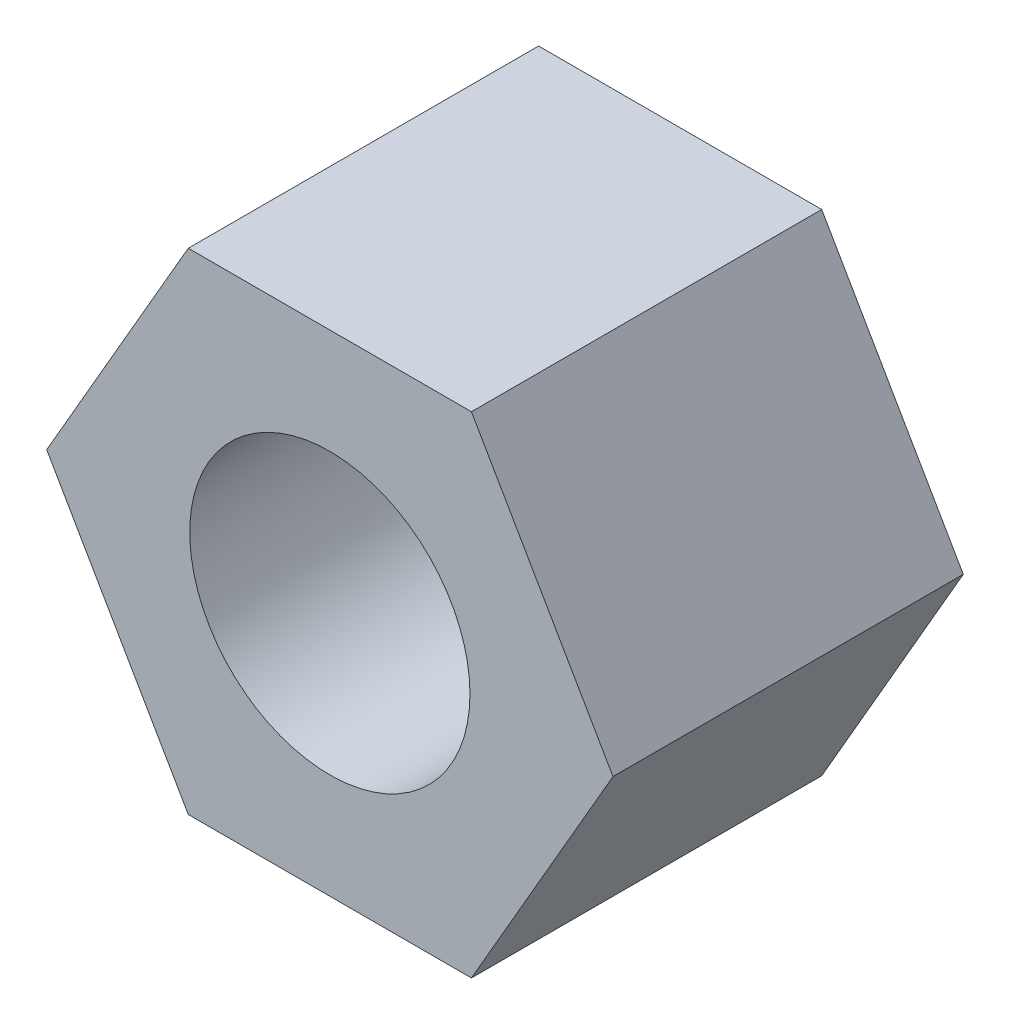
ISO-10303-21;
HEADER;
FILE_DESCRIPTION(('STEP AP214'),'2;1');
FILE_NAME('part.step','',(''),(''),'','','');
FILE_SCHEMA(('AUTOMOTIVE_DESIGN { 1 0 10303 214 1 1 1 1 }'));
ENDSEC;
DATA;
#1=APPLICATION_CONTEXT('core data for automotive mechanical design processes');
#2=APPLICATION_PROTOCOL_DEFINITION('international standard','automotive_design',2000,#1);
#3=PRODUCT_CONTEXT('',#1,'mechanical');
#4=PRODUCT('Part','Part','',(#3));
#5=PRODUCT_RELATED_PRODUCT_CATEGORY('part','',(#4));
#6=PRODUCT_DEFINITION_FORMATION('','',#4);
#7=PRODUCT_DEFINITION_CONTEXT('part definition',#1,'design');
#8=PRODUCT_DEFINITION('design','',#6,#7);
#9=PRODUCT_DEFINITION_SHAPE('','',#8);
#10=(LENGTH_UNIT() NAMED_UNIT(*) SI_UNIT(.MILLI.,.METRE.));
#11=(NAMED_UNIT(*) PLANE_ANGLE_UNIT() SI_UNIT($,.RADIAN.));
#12=(NAMED_UNIT(*) SI_UNIT($,.STERADIAN.) SOLID_ANGLE_UNIT());
#13=UNCERTAINTY_MEASURE_WITH_UNIT(LENGTH_MEASURE(1.E-05),#10,'distance_accuracy_value','');
#14=(GEOMETRIC_REPRESENTATION_CONTEXT(3) GLOBAL_UNCERTAINTY_ASSIGNED_CONTEXT((#13)) GLOBAL_UNIT_ASSIGNED_CONTEXT((#10,
#11,#12)) REPRESENTATION_CONTEXT('',''));
#15=CARTESIAN_POINT('',(0.,0.,0.));
#16=DIRECTION('',(0.,0.,1.));
#17=DIRECTION('',(1.,0.,0.));
#18=AXIS2_PLACEMENT_3D('',#15,#16,#17);
#19=CARTESIAN_POINT('',(0.,0.,5.));
#20=DIRECTION('',(0.,0.,1.));
#21=DIRECTION('',(1.,0.,0.));
#22=AXIS2_PLACEMENT_3D('',#19,#20,#21);
#23=PLANE('',#22);
#24=DIRECTION('',(0.5,0.866025403784439,0.));
#25=VECTOR('',#24,1.);
#26=CARTESIAN_POINT('',(2.02072594216369,-3.5,5.));
#27=LINE('',#26,#25);
#28=CARTESIAN_POINT('',(2.02072594216369,-3.5,5.));
#29=VERTEX_POINT('',#28);
#30=CARTESIAN_POINT('',(4.04145188432738,0.,5.));
#31=VERTEX_POINT('',#30);
#32=EDGE_CURVE('E132',#29,#31,#27,.T.);
#33=ORIENTED_EDGE('',*,*,#32,.T.);
#34=DIRECTION('',(-0.5,0.866025403784439,0.));
#35=VECTOR('',#34,1.);
#36=CARTESIAN_POINT('',(4.04145188432738,0.,5.));
#37=LINE('',#36,#35);
#38=CARTESIAN_POINT('',(2.02072594216369,3.5,5.));
#39=VERTEX_POINT('',#38);
#40=EDGE_CURVE('E91',#31,#39,#37,.T.);
#41=ORIENTED_EDGE('',*,*,#40,.T.);
#42=DIRECTION('',(-1.,0.,0.));
#43=VECTOR('',#42,1.);
#44=CARTESIAN_POINT('',(2.02072594216369,3.5,5.));
#45=LINE('',#44,#43);
#46=CARTESIAN_POINT('',(-2.02072594216369,3.5,5.));
#47=VERTEX_POINT('',#46);
#48=EDGE_CURVE('E106',#39,#47,#45,.T.);
#49=ORIENTED_EDGE('',*,*,#48,.T.);
#50=DIRECTION('',(-0.5,-0.866025403784439,0.));
#51=VECTOR('',#50,1.);
#52=CARTESIAN_POINT('',(-2.02072594216369,3.5,5.));
#53=LINE('',#52,#51);
#54=CARTESIAN_POINT('',(-4.04145188432738,0.,5.));
#55=VERTEX_POINT('',#54);
#56=EDGE_CURVE('E99',#47,#55,#53,.T.);
#57=ORIENTED_EDGE('',*,*,#56,.T.);
#58=DIRECTION('',(0.5,-0.866025403784439,0.));
#59=VECTOR('',#58,1.);
#60=CARTESIAN_POINT('',(-4.04145188432738,0.,5.));
#61=LINE('',#60,#59);
#62=CARTESIAN_POINT('',(-2.02072594216369,-3.5,5.));
#63=VERTEX_POINT('',#62);
#64=EDGE_CURVE('E102',#55,#63,#61,.T.);
#65=ORIENTED_EDGE('',*,*,#64,.T.);
#66=DIRECTION('',(1.,0.,0.));
#67=VECTOR('',#66,1.);
#68=CARTESIAN_POINT('',(-2.02072594216369,-3.5,5.));
#69=LINE('',#68,#67);
#70=EDGE_CURVE('E57',#63,#29,#69,.T.);
#71=ORIENTED_EDGE('',*,*,#70,.T.);
#72=EDGE_LOOP('',(#33,#41,#49,#57,#65,#71));
#73=FACE_BOUND('',#72,.T.);
#74=CARTESIAN_POINT('',(0.,0.,5.));
#75=DIRECTION('',(0.,0.,1.));
#76=DIRECTION('',(1.,0.,0.));
#77=AXIS2_PLACEMENT_3D('',#74,#75,#76);
#78=CIRCLE('',#77,2.);
#79=CARTESIAN_POINT('',(2.,0.,5.));
#80=VERTEX_POINT('',#79);
#81=EDGE_CURVE('E126',#80,#80,#78,.T.);
#82=ORIENTED_EDGE('',*,*,#81,.F.);
#83=EDGE_LOOP('',(#82));
#84=FACE_BOUND('',#83,.T.);
#85=ADVANCED_FACE('F39',(#73,#84),#23,.T.);
#86=CARTESIAN_POINT('',(0.,0.,0.));
#87=DIRECTION('',(0.,0.,1.));
#88=DIRECTION('',(1.,0.,0.));
#89=AXIS2_PLACEMENT_3D('',#86,#87,#88);
#90=PLANE('',#89);
#91=DIRECTION('',(0.5,0.866025403784439,0.));
#92=VECTOR('',#91,1.);
#93=CARTESIAN_POINT('',(2.02072594216369,-3.5,0.));
#94=LINE('',#93,#92);
#95=CARTESIAN_POINT('',(2.02072594216369,-3.5,0.));
#96=VERTEX_POINT('',#95);
#97=CARTESIAN_POINT('',(4.04145188432738,0.,0.));
#98=VERTEX_POINT('',#97);
#99=EDGE_CURVE('E121',#96,#98,#94,.T.);
#100=ORIENTED_EDGE('',*,*,#99,.F.);
#101=DIRECTION('',(1.,0.,0.));
#102=VECTOR('',#101,1.);
#103=CARTESIAN_POINT('',(-2.02072594216369,-3.5,0.));
#104=LINE('',#103,#102);
#105=CARTESIAN_POINT('',(-2.02072594216369,-3.5,0.));
#106=VERTEX_POINT('',#105);
#107=EDGE_CURVE('E83',#106,#96,#104,.T.);
#108=ORIENTED_EDGE('',*,*,#107,.F.);
#109=DIRECTION('',(0.5,-0.866025403784439,0.));
#110=VECTOR('',#109,1.);
#111=CARTESIAN_POINT('',(-4.04145188432738,0.,0.));
#112=LINE('',#111,#110);
#113=CARTESIAN_POINT('',(-4.04145188432738,0.,0.));
#114=VERTEX_POINT('',#113);
#115=EDGE_CURVE('E78',#114,#106,#112,.T.);
#116=ORIENTED_EDGE('',*,*,#115,.F.);
#117=DIRECTION('',(-0.5,-0.866025403784439,0.));
#118=VECTOR('',#117,1.);
#119=CARTESIAN_POINT('',(-2.02072594216369,3.5,0.));
#120=LINE('',#119,#118);
#121=CARTESIAN_POINT('',(-2.02072594216369,3.5,0.));
#122=VERTEX_POINT('',#121);
#123=EDGE_CURVE('E111',#122,#114,#120,.T.);
#124=ORIENTED_EDGE('',*,*,#123,.F.);
#125=DIRECTION('',(-1.,0.,0.));
#126=VECTOR('',#125,1.);
#127=CARTESIAN_POINT('',(2.02072594216369,3.5,0.));
#128=LINE('',#127,#126);
#129=CARTESIAN_POINT('',(2.02072594216369,3.5,0.));
#130=VERTEX_POINT('',#129);
#131=EDGE_CURVE('E128',#130,#122,#128,.T.);
#132=ORIENTED_EDGE('',*,*,#131,.F.);
#133=DIRECTION('',(-0.5,0.866025403784439,0.));
#134=VECTOR('',#133,1.);
#135=CARTESIAN_POINT('',(4.04145188432738,0.,0.));
#136=LINE('',#135,#134);
#137=EDGE_CURVE('E130',#98,#130,#136,.T.);
#138=ORIENTED_EDGE('',*,*,#137,.F.);
#139=EDGE_LOOP('',(#100,#108,#116,#124,#132,#138));
#140=FACE_BOUND('',#139,.T.);
#141=CARTESIAN_POINT('',(0.,0.,0.));
#142=DIRECTION('',(0.,0.,1.));
#143=DIRECTION('',(1.,0.,0.));
#144=AXIS2_PLACEMENT_3D('',#141,#142,#143);
#145=CIRCLE('',#144,2.);
#146=CARTESIAN_POINT('',(2.,0.,0.));
#147=VERTEX_POINT('',#146);
#148=EDGE_CURVE('E230',#147,#147,#145,.T.);
#149=ORIENTED_EDGE('',*,*,#148,.T.);
#150=EDGE_LOOP('',(#149));
#151=FACE_BOUND('',#150,.T.);
#152=ADVANCED_FACE('F145',(#140,#151),#90,.F.);
#153=CARTESIAN_POINT('',(2.02072594216369,-3.5,5.));
#154=DIRECTION('',(-0.866025403784439,0.5,0.));
#155=DIRECTION('',(-0.5,-0.866025403784439,0.));
#156=AXIS2_PLACEMENT_3D('',#153,#154,#155);
#157=PLANE('',#156);
#158=ORIENTED_EDGE('',*,*,#99,.T.);
#159=DIRECTION('',(0.,0.,-1.));
#160=VECTOR('',#159,1.);
#161=CARTESIAN_POINT('',(4.04145188432738,0.,5.));
#162=LINE('',#161,#160);
#163=EDGE_CURVE('E11',#31,#98,#162,.T.);
#164=ORIENTED_EDGE('',*,*,#163,.F.);
#165=ORIENTED_EDGE('',*,*,#32,.F.);
#166=DIRECTION('',(0.,0.,-1.));
#167=VECTOR('',#166,1.);
#168=CARTESIAN_POINT('',(2.02072594216369,-3.5,5.));
#169=LINE('',#168,#167);
#170=EDGE_CURVE('E117',#29,#96,#169,.T.);
#171=ORIENTED_EDGE('',*,*,#170,.T.);
#172=EDGE_LOOP('',(#158,#164,#165,#171));
#173=FACE_BOUND('',#172,.T.);
#174=ADVANCED_FACE('F41',(#173),#157,.F.);
#175=CARTESIAN_POINT('',(4.04145188432738,0.,5.));
#176=DIRECTION('',(-0.866025403784439,-0.5,0.));
#177=DIRECTION('',(0.5,-0.866025403784439,0.));
#178=AXIS2_PLACEMENT_3D('',#175,#176,#177);
#179=PLANE('',#178);
#180=ORIENTED_EDGE('',*,*,#137,.T.);
#181=DIRECTION('',(0.,0.,-1.));
#182=VECTOR('',#181,1.);
#183=CARTESIAN_POINT('',(2.02072594216369,3.5,5.));
#184=LINE('',#183,#182);
#185=EDGE_CURVE('E48',#39,#130,#184,.T.);
#186=ORIENTED_EDGE('',*,*,#185,.F.);
#187=ORIENTED_EDGE('',*,*,#40,.F.);
#188=ORIENTED_EDGE('',*,*,#163,.T.);
#189=EDGE_LOOP('',(#180,#186,#187,#188));
#190=FACE_BOUND('',#189,.T.);
#191=ADVANCED_FACE('F166',(#190),#179,.F.);
#192=CARTESIAN_POINT('',(2.02072594216369,3.5,5.));
#193=DIRECTION('',(0.,-1.,0.));
#194=DIRECTION('',(1.,0.,0.));
#195=AXIS2_PLACEMENT_3D('',#192,#193,#194);
#196=PLANE('',#195);
#197=ORIENTED_EDGE('',*,*,#131,.T.);
#198=DIRECTION('',(0.,0.,-1.));
#199=VECTOR('',#198,1.);
#200=CARTESIAN_POINT('',(-2.02072594216369,3.5,5.));
#201=LINE('',#200,#199);
#202=EDGE_CURVE('E113',#47,#122,#201,.T.);
#203=ORIENTED_EDGE('',*,*,#202,.F.);
#204=ORIENTED_EDGE('',*,*,#48,.F.);
#205=ORIENTED_EDGE('',*,*,#185,.T.);
#206=EDGE_LOOP('',(#197,#203,#204,#205));
#207=FACE_BOUND('',#206,.T.);
#208=ADVANCED_FACE('F143',(#207),#196,.F.);
#209=CARTESIAN_POINT('',(-2.02072594216369,3.5,5.));
#210=DIRECTION('',(0.866025403784439,-0.5,0.));
#211=DIRECTION('',(0.5,0.866025403784439,0.));
#212=AXIS2_PLACEMENT_3D('',#209,#210,#211);
#213=PLANE('',#212);
#214=ORIENTED_EDGE('',*,*,#123,.T.);
#215=DIRECTION('',(0.,0.,-1.));
#216=VECTOR('',#215,1.);
#217=CARTESIAN_POINT('',(-4.04145188432738,0.,5.));
#218=LINE('',#217,#216);
#219=EDGE_CURVE('E112',#55,#114,#218,.T.);
#220=ORIENTED_EDGE('',*,*,#219,.F.);
#221=ORIENTED_EDGE('',*,*,#56,.F.);
#222=ORIENTED_EDGE('',*,*,#202,.T.);
#223=EDGE_LOOP('',(#214,#220,#221,#222));
#224=FACE_BOUND('',#223,.T.);
#225=ADVANCED_FACE('F115',(#224),#213,.F.);
#226=CARTESIAN_POINT('',(-4.04145188432738,0.,5.));
#227=DIRECTION('',(0.866025403784439,0.5,0.));
#228=DIRECTION('',(-0.5,0.866025403784439,0.));
#229=AXIS2_PLACEMENT_3D('',#226,#227,#228);
#230=PLANE('',#229);
#231=ORIENTED_EDGE('',*,*,#115,.T.);
#232=DIRECTION('',(0.,0.,-1.));
#233=VECTOR('',#232,1.);
#234=CARTESIAN_POINT('',(-2.02072594216369,-3.5,5.));
#235=LINE('',#234,#233);
#236=EDGE_CURVE('E119',#63,#106,#235,.T.);
#237=ORIENTED_EDGE('',*,*,#236,.F.);
#238=ORIENTED_EDGE('',*,*,#64,.F.);
#239=ORIENTED_EDGE('',*,*,#219,.T.);
#240=EDGE_LOOP('',(#231,#237,#238,#239));
#241=FACE_BOUND('',#240,.T.);
#242=ADVANCED_FACE('F120',(#241),#230,.F.);
#243=CARTESIAN_POINT('',(-2.02072594216369,-3.5,5.));
#244=DIRECTION('',(0.,1.,0.));
#245=DIRECTION('',(-1.,0.,0.));
#246=AXIS2_PLACEMENT_3D('',#243,#244,#245);
#247=PLANE('',#246);
#248=ORIENTED_EDGE('',*,*,#107,.T.);
#249=ORIENTED_EDGE('',*,*,#170,.F.);
#250=ORIENTED_EDGE('',*,*,#70,.F.);
#251=ORIENTED_EDGE('',*,*,#236,.T.);
#252=EDGE_LOOP('',(#248,#249,#250,#251));
#253=FACE_BOUND('',#252,.T.);
#254=ADVANCED_FACE('F149',(#253),#247,.F.);
#255=CARTESIAN_POINT('',(0.,0.,5.));
#256=DIRECTION('',(0.,0.,-1.));
#257=DIRECTION('',(-1.,0.,0.));
#258=AXIS2_PLACEMENT_3D('',#255,#256,#257);
#259=CYLINDRICAL_SURFACE('',#258,2.);
#260=ORIENTED_EDGE('',*,*,#81,.T.);
#261=EDGE_LOOP('',(#260));
#262=FACE_BOUND('',#261,.T.);
#263=ORIENTED_EDGE('',*,*,#148,.F.);
#264=EDGE_LOOP('',(#263));
#265=FACE_BOUND('',#264,.T.);
#266=ADVANCED_FACE('F151',(#262,#265),#259,.F.);
#267=CLOSED_SHELL('',(#85,#152,#174,#191,#208,#225,#242,#254,#266));
#268=MANIFOLD_SOLID_BREP('B2',#267);
#269=ADVANCED_BREP_SHAPE_REPRESENTATION('',(#18,#268),#14);
#270=SHAPE_DEFINITION_REPRESENTATION(#9,#269);
ENDSEC;
END-ISO-10303-21;
